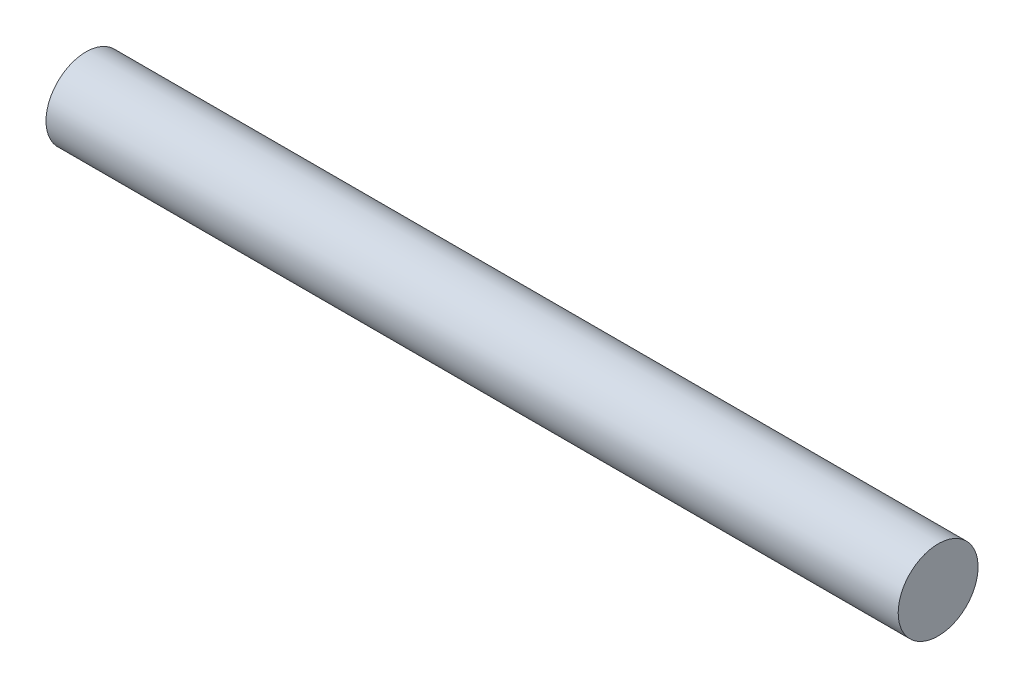
ISO-10303-21;
HEADER;
FILE_DESCRIPTION(('STEP AP214'),'2;1');
FILE_NAME('part.step','',(''),(''),'','','');
FILE_SCHEMA(('AUTOMOTIVE_DESIGN { 1 0 10303 214 1 1 1 1 }'));
ENDSEC;
DATA;
#1=APPLICATION_CONTEXT('core data for automotive mechanical design processes');
#2=APPLICATION_PROTOCOL_DEFINITION('international standard','automotive_design',2000,#1);
#3=PRODUCT_CONTEXT('',#1,'mechanical');
#4=PRODUCT('Part','Part','',(#3));
#5=PRODUCT_RELATED_PRODUCT_CATEGORY('part','',(#4));
#6=PRODUCT_DEFINITION_FORMATION('','',#4);
#7=PRODUCT_DEFINITION_CONTEXT('part definition',#1,'design');
#8=PRODUCT_DEFINITION('design','',#6,#7);
#9=PRODUCT_DEFINITION_SHAPE('','',#8);
#10=(LENGTH_UNIT() NAMED_UNIT(*) SI_UNIT(.MILLI.,.METRE.));
#11=(NAMED_UNIT(*) PLANE_ANGLE_UNIT() SI_UNIT($,.RADIAN.));
#12=(NAMED_UNIT(*) SI_UNIT($,.STERADIAN.) SOLID_ANGLE_UNIT());
#13=UNCERTAINTY_MEASURE_WITH_UNIT(LENGTH_MEASURE(1.E-05),#10,'distance_accuracy_value','');
#14=(GEOMETRIC_REPRESENTATION_CONTEXT(3) GLOBAL_UNCERTAINTY_ASSIGNED_CONTEXT((#13)) GLOBAL_UNIT_ASSIGNED_CONTEXT((#10,
#11,#12)) REPRESENTATION_CONTEXT('',''));
#15=CARTESIAN_POINT('',(0.,0.,0.));
#16=DIRECTION('',(0.,0.,1.));
#17=DIRECTION('',(1.,0.,0.));
#18=AXIS2_PLACEMENT_3D('',#15,#16,#17);
#19=CARTESIAN_POINT('',(16.,-0.75,0.));
#20=DIRECTION('',(-1.,0.,0.));
#21=DIRECTION('',(0.,0.,1.));
#22=AXIS2_PLACEMENT_3D('',#19,#20,#21);
#23=PLANE('',#22);
#24=CARTESIAN_POINT('',(16.,-0.75,0.));
#25=DIRECTION('',(-1.,0.,0.));
#26=DIRECTION('',(0.,0.,1.));
#27=AXIS2_PLACEMENT_3D('',#24,#25,#26);
#28=CIRCLE('',#27,1.5);
#29=CARTESIAN_POINT('',(16.,-0.75,1.5));
#30=VERTEX_POINT('',#29);
#31=EDGE_CURVE('E43',#30,#30,#28,.T.);
#32=ORIENTED_EDGE('',*,*,#31,.F.);
#33=EDGE_LOOP('',(#32));
#34=FACE_BOUND('',#33,.T.);
#35=ADVANCED_FACE('F37',(#34),#23,.F.);
#36=CARTESIAN_POINT('',(-16.,-0.75,0.));
#37=DIRECTION('',(1.,0.,0.));
#38=DIRECTION('',(0.,0.,-1.));
#39=AXIS2_PLACEMENT_3D('',#36,#37,#38);
#40=PLANE('',#39);
#41=CARTESIAN_POINT('',(-16.,-0.75,0.));
#42=DIRECTION('',(-1.,0.,0.));
#43=DIRECTION('',(0.,0.,1.));
#44=AXIS2_PLACEMENT_3D('',#41,#42,#43);
#45=CIRCLE('',#44,1.5);
#46=CARTESIAN_POINT('',(-16.,-0.75,1.5));
#47=VERTEX_POINT('',#46);
#48=EDGE_CURVE('E10',#47,#47,#45,.T.);
#49=ORIENTED_EDGE('',*,*,#48,.T.);
#50=EDGE_LOOP('',(#49));
#51=FACE_BOUND('',#50,.T.);
#52=ADVANCED_FACE('F52',(#51),#40,.F.);
#53=CARTESIAN_POINT('',(-16.,-0.75,0.));
#54=DIRECTION('',(-1.,0.,0.));
#55=DIRECTION('',(0.,0.,1.));
#56=AXIS2_PLACEMENT_3D('',#53,#54,#55);
#57=CYLINDRICAL_SURFACE('',#56,1.5);
#58=ORIENTED_EDGE('',*,*,#48,.F.);
#59=EDGE_LOOP('',(#58));
#60=FACE_BOUND('',#59,.T.);
#61=ORIENTED_EDGE('',*,*,#31,.T.);
#62=EDGE_LOOP('',(#61));
#63=FACE_BOUND('',#62,.T.);
#64=ADVANCED_FACE('F49',(#60,#63),#57,.T.);
#65=CLOSED_SHELL('',(#35,#52,#64));
#66=MANIFOLD_SOLID_BREP('B2',#65);
#67=ADVANCED_BREP_SHAPE_REPRESENTATION('',(#18,#66),#14);
#68=SHAPE_DEFINITION_REPRESENTATION(#9,#67);
ENDSEC;
END-ISO-10303-21;
